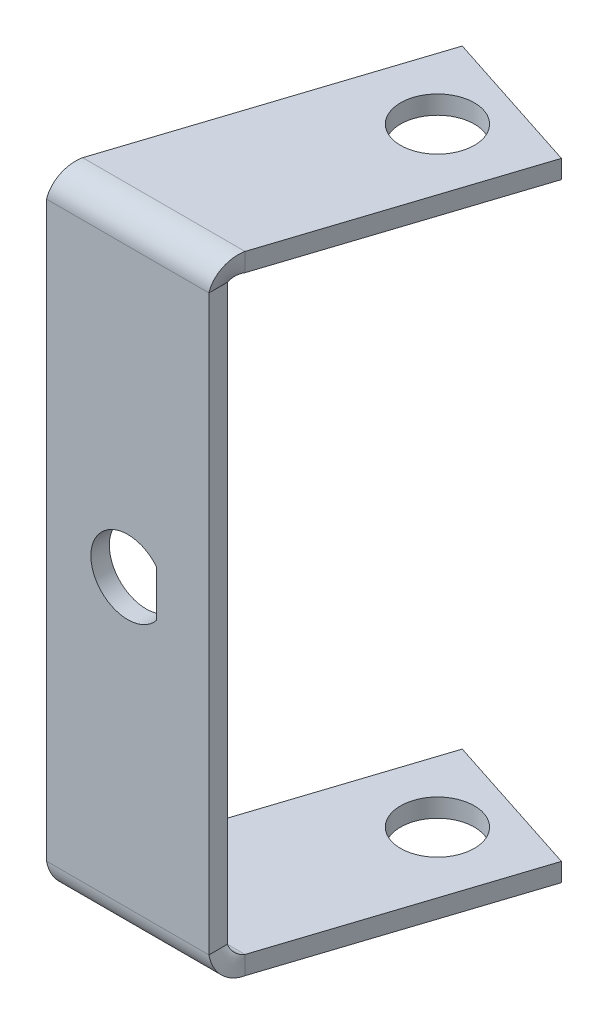
ISO-10303-21;
HEADER;
FILE_DESCRIPTION(('STEP AP214'),'2;1');
FILE_NAME('part.step','',(''),(''),'','','');
FILE_SCHEMA(('AUTOMOTIVE_DESIGN { 1 0 10303 214 1 1 1 1 }'));
ENDSEC;
DATA;
#1=APPLICATION_CONTEXT('core data for automotive mechanical design processes');
#2=APPLICATION_PROTOCOL_DEFINITION('international standard','automotive_design',2000,#1);
#3=PRODUCT_CONTEXT('',#1,'mechanical');
#4=PRODUCT('Part','Part','',(#3));
#5=PRODUCT_RELATED_PRODUCT_CATEGORY('part','',(#4));
#6=PRODUCT_DEFINITION_FORMATION('','',#4);
#7=PRODUCT_DEFINITION_CONTEXT('part definition',#1,'design');
#8=PRODUCT_DEFINITION('design','',#6,#7);
#9=PRODUCT_DEFINITION_SHAPE('','',#8);
#10=(LENGTH_UNIT() NAMED_UNIT(*) SI_UNIT(.MILLI.,.METRE.));
#11=(NAMED_UNIT(*) PLANE_ANGLE_UNIT() SI_UNIT($,.RADIAN.));
#12=(NAMED_UNIT(*) SI_UNIT($,.STERADIAN.) SOLID_ANGLE_UNIT());
#13=UNCERTAINTY_MEASURE_WITH_UNIT(LENGTH_MEASURE(1.E-05),#10,'distance_accuracy_value','');
#14=(GEOMETRIC_REPRESENTATION_CONTEXT(3) GLOBAL_UNCERTAINTY_ASSIGNED_CONTEXT((#13)) GLOBAL_UNIT_ASSIGNED_CONTEXT((#10,
#11,#12)) REPRESENTATION_CONTEXT('',''));
#15=CARTESIAN_POINT('',(0.,0.,0.));
#16=DIRECTION('',(0.,0.,1.));
#17=DIRECTION('',(1.,0.,0.));
#18=AXIS2_PLACEMENT_3D('',#15,#16,#17);
#19=CARTESIAN_POINT('',(0.,0.,-1.5875));
#20=DIRECTION('',(0.,0.,1.));
#21=DIRECTION('',(1.,0.,0.));
#22=AXIS2_PLACEMENT_3D('',#19,#20,#21);
#23=PLANE('',#22);
#24=DIRECTION('',(0.,1.,0.));
#25=VECTOR('',#24,1.);
#26=CARTESIAN_POINT('',(2.4892,-1.97091561463195,-1.5875));
#27=LINE('',#26,#25);
#28=CARTESIAN_POINT('',(2.4892,-1.97091561463195,-1.5875));
#29=VERTEX_POINT('',#28);
#30=CARTESIAN_POINT('',(2.4892,1.97091561463193,-1.5875));
#31=VERTEX_POINT('',#30);
#32=EDGE_CURVE('E441',#29,#31,#27,.T.);
#33=ORIENTED_EDGE('',*,*,#32,.T.);
#34=CARTESIAN_POINT('',(0.,0.,-1.5875));
#35=DIRECTION('',(0.,0.,1.));
#36=DIRECTION('',(1.,0.,0.));
#37=AXIS2_PLACEMENT_3D('',#34,#35,#36);
#38=CIRCLE('',#37,3.175);
#39=EDGE_CURVE('E432',#31,#29,#38,.T.);
#40=ORIENTED_EDGE('',*,*,#39,.T.);
#41=EDGE_LOOP('',(#33,#40));
#42=FACE_BOUND('',#41,.T.);
#43=DIRECTION('',(0.,1.,0.));
#44=VECTOR('',#43,1.);
#45=CARTESIAN_POINT('',(6.985,24.6634,-1.5875));
#46=LINE('',#45,#44);
#47=CARTESIAN_POINT('',(6.985,-24.6634,-1.5875));
#48=VERTEX_POINT('',#47);
#49=CARTESIAN_POINT('',(6.985,24.6634,-1.5875));
#50=VERTEX_POINT('',#49);
#51=EDGE_CURVE('E440',#48,#50,#46,.T.);
#52=ORIENTED_EDGE('',*,*,#51,.F.);
#53=DIRECTION('',(-1.,0.,0.));
#54=VECTOR('',#53,1.);
#55=CARTESIAN_POINT('',(0.,-24.6634,-1.5875));
#56=LINE('',#55,#54);
#57=CARTESIAN_POINT('',(-6.98499999999999,-24.6634,-1.5875));
#58=VERTEX_POINT('',#57);
#59=EDGE_CURVE('E578',#48,#58,#56,.T.);
#60=ORIENTED_EDGE('',*,*,#59,.T.);
#61=DIRECTION('',(0.,-1.,0.));
#62=VECTOR('',#61,1.);
#63=CARTESIAN_POINT('',(-6.985,24.6634,-1.5875));
#64=LINE('',#63,#62);
#65=CARTESIAN_POINT('',(-6.985,24.6634,-1.5875));
#66=VERTEX_POINT('',#65);
#67=EDGE_CURVE('E663',#66,#58,#64,.T.);
#68=ORIENTED_EDGE('',*,*,#67,.F.);
#69=DIRECTION('',(-1.,0.,0.));
#70=VECTOR('',#69,1.);
#71=CARTESIAN_POINT('',(0.,24.6634,-1.5875));
#72=LINE('',#71,#70);
#73=EDGE_CURVE('E474',#50,#66,#72,.T.);
#74=ORIENTED_EDGE('',*,*,#73,.F.);
#75=EDGE_LOOP('',(#52,#60,#68,#74));
#76=FACE_BOUND('',#75,.T.);
#77=ADVANCED_FACE('F73',(#42,#76),#23,.F.);
#78=CARTESIAN_POINT('',(0.,25.4000000000001,24.7431681587106));
#79=DIRECTION('',(0.,1.,0.));
#80=DIRECTION('',(1.,0.,0.));
#81=AXIS2_PLACEMENT_3D('',#78,#79,#80);
#82=PLANE('',#81);
#83=CARTESIAN_POINT('',(6.5537818899881,25.4,-20.0906984703436));
#84=DIRECTION('',(0.,1.,0.));
#85=DIRECTION('',(1.,0.,0.));
#86=AXIS2_PLACEMENT_3D('',#83,#84,#85);
#87=CIRCLE('',#86,3.175);
#88=CARTESIAN_POINT('',(9.7287818899881,25.4,-20.0906984703436));
#89=VERTEX_POINT('',#88);
#90=EDGE_CURVE('E613',#89,#89,#87,.T.);
#91=ORIENTED_EDGE('',*,*,#90,.T.);
#92=EDGE_LOOP('',(#91));
#93=FACE_BOUND('',#92,.T.);
#94=DIRECTION('',(0.309016994374941,0.,-0.951056516295156));
#95=VECTOR('',#94,1.);
#96=CARTESIAN_POINT('',(6.985,25.4,0.0797681587105803));
#97=LINE('',#96,#95);
#98=CARTESIAN_POINT('',(7.76606411191218,25.4,-2.32410000000001));
#99=VERTEX_POINT('',#98);
#100=CARTESIAN_POINT('',(14.4415800742673,25.3999999999999,-22.8692255794915));
#101=VERTEX_POINT('',#100);
#102=EDGE_CURVE('E602',#99,#101,#97,.T.);
#103=ORIENTED_EDGE('',*,*,#102,.F.);
#104=DIRECTION('',(-1.,0.,0.));
#105=VECTOR('',#104,1.);
#106=CARTESIAN_POINT('',(0.,25.4,-2.32410000000001));
#107=LINE('',#106,#105);
#108=CARTESIAN_POINT('',(-6.20393588808782,25.4,-2.3241));
#109=VERTEX_POINT('',#108);
#110=EDGE_CURVE('E593',#99,#109,#107,.T.);
#111=ORIENTED_EDGE('',*,*,#110,.T.);
#112=DIRECTION('',(-0.309016994374941,0.,0.951056516295156));
#113=VECTOR('',#112,1.);
#114=CARTESIAN_POINT('',(1.80559636855826,25.3999999999999,-26.9749055667544));
#115=LINE('',#114,#113);
#116=CARTESIAN_POINT('',(1.80559636855826,25.3999999999999,-26.9749055667544));
#117=VERTEX_POINT('',#116);
#118=EDGE_CURVE('E622',#117,#109,#115,.T.);
#119=ORIENTED_EDGE('',*,*,#118,.F.);
#120=DIRECTION('',(-0.951056516295156,0.,-0.309016994374941));
#121=VECTOR('',#120,1.);
#122=CARTESIAN_POINT('',(14.4415800742673,25.3999999999999,-22.8692255794915));
#123=LINE('',#122,#121);
#124=EDGE_CURVE('E608',#101,#117,#123,.T.);
#125=ORIENTED_EDGE('',*,*,#124,.F.);
#126=EDGE_LOOP('',(#103,#111,#119,#125));
#127=FACE_BOUND('',#126,.T.);
#128=ADVANCED_FACE('F539',(#93,#127),#82,.F.);
#129=CARTESIAN_POINT('',(1.80559636855826,25.3999999999999,-26.9749055667544));
#130=DIRECTION('',(-0.951056516295156,0.,-0.309016994374941));
#131=DIRECTION('',(-0.309016994374941,0.,0.951056516295156));
#132=AXIS2_PLACEMENT_3D('',#129,#130,#131);
#133=PLANE('',#132);
#134=CARTESIAN_POINT('',(-6.20393588808782,26.9875,-2.32410000000002));
#135=CARTESIAN_POINT('',(-6.20393588808782,25.4,-2.32410000000001));
#136=B_SPLINE_CURVE_WITH_KNOTS('',1,(#134,#135),.UNSPECIFIED.,.F.,.F.,(2,2),(0.,1.),.UNSPECIFIED.);
#137=CARTESIAN_POINT('',(-6.20393588808782,26.9875,-2.32410000000002));
#138=VERTEX_POINT('',#137);
#139=EDGE_CURVE('E585',#138,#109,#136,.T.);
#140=ORIENTED_EDGE('',*,*,#139,.F.);
#141=DIRECTION('',(-0.309016994374941,0.,0.951056516295156));
#142=VECTOR('',#141,1.);
#143=CARTESIAN_POINT('',(1.80559636855826,26.9874999999999,-26.9749055667544));
#144=LINE('',#143,#142);
#145=CARTESIAN_POINT('',(1.80559636855826,26.9874999999999,-26.9749055667544));
#146=VERTEX_POINT('',#145);
#147=EDGE_CURVE('E600',#146,#138,#144,.T.);
#148=ORIENTED_EDGE('',*,*,#147,.F.);
#149=DIRECTION('',(0.,1.,0.));
#150=VECTOR('',#149,1.);
#151=CARTESIAN_POINT('',(1.80559636855826,25.3999999999999,-26.9749055667544));
#152=LINE('',#151,#150);
#153=EDGE_CURVE('E617',#117,#146,#152,.T.);
#154=ORIENTED_EDGE('',*,*,#153,.F.);
#155=ORIENTED_EDGE('',*,*,#118,.T.);
#156=EDGE_LOOP('',(#140,#148,#154,#155));
#157=FACE_BOUND('',#156,.T.);
#158=ADVANCED_FACE('F544',(#157),#133,.T.);
#159=CARTESIAN_POINT('',(14.4415800742673,25.3999999999999,-22.8692255794915));
#160=DIRECTION('',(0.309016994374941,0.,-0.951056516295156));
#161=DIRECTION('',(-0.951056516295156,0.,-0.309016994374941));
#162=AXIS2_PLACEMENT_3D('',#159,#160,#161);
#163=PLANE('',#162);
#164=DIRECTION('',(-0.951056516295156,0.,-0.309016994374941));
#165=VECTOR('',#164,1.);
#166=CARTESIAN_POINT('',(14.4415800742673,26.9874999999999,-22.8692255794915));
#167=LINE('',#166,#165);
#168=CARTESIAN_POINT('',(14.4415800742673,26.9874999999999,-22.8692255794915));
#169=VERTEX_POINT('',#168);
#170=EDGE_CURVE('E603',#169,#146,#167,.T.);
#171=ORIENTED_EDGE('',*,*,#170,.F.);
#172=DIRECTION('',(0.,1.,0.));
#173=VECTOR('',#172,1.);
#174=CARTESIAN_POINT('',(14.4415800742673,25.3999999999999,-22.8692255794915));
#175=LINE('',#174,#173);
#176=EDGE_CURVE('E619',#101,#169,#175,.T.);
#177=ORIENTED_EDGE('',*,*,#176,.F.);
#178=ORIENTED_EDGE('',*,*,#124,.T.);
#179=ORIENTED_EDGE('',*,*,#153,.T.);
#180=EDGE_LOOP('',(#171,#177,#178,#179));
#181=FACE_BOUND('',#180,.T.);
#182=ADVANCED_FACE('F552',(#181),#163,.T.);
#183=CARTESIAN_POINT('',(6.985,25.4,0.0797681587105803));
#184=DIRECTION('',(0.951056516295156,0.,0.309016994374941));
#185=DIRECTION('',(0.309016994374941,0.,-0.951056516295156));
#186=AXIS2_PLACEMENT_3D('',#183,#184,#185);
#187=PLANE('',#186);
#188=CARTESIAN_POINT('',(7.76606411191218,25.4,-2.32410000000001));
#189=CARTESIAN_POINT('',(7.76606411191218,26.9875,-2.32410000000002));
#190=B_SPLINE_CURVE_WITH_KNOTS('',1,(#188,#189),.UNSPECIFIED.,.F.,.F.,(2,2),(0.,1.),.UNSPECIFIED.);
#191=CARTESIAN_POINT('',(7.76606411191218,26.9875,-2.32410000000002));
#192=VERTEX_POINT('',#191);
#193=EDGE_CURVE('E590',#99,#192,#190,.T.);
#194=ORIENTED_EDGE('',*,*,#193,.F.);
#195=ORIENTED_EDGE('',*,*,#102,.T.);
#196=ORIENTED_EDGE('',*,*,#176,.T.);
#197=DIRECTION('',(0.309016994374941,0.,-0.951056516295156));
#198=VECTOR('',#197,1.);
#199=CARTESIAN_POINT('',(6.985,26.9875,0.0797681587105734));
#200=LINE('',#199,#198);
#201=EDGE_CURVE('E610',#192,#169,#200,.T.);
#202=ORIENTED_EDGE('',*,*,#201,.F.);
#203=EDGE_LOOP('',(#194,#195,#196,#202));
#204=FACE_BOUND('',#203,.T.);
#205=ADVANCED_FACE('F637',(#204),#187,.T.);
#206=CARTESIAN_POINT('',(0.,26.9875000000001,24.7431681587106));
#207=DIRECTION('',(0.,1.,0.));
#208=DIRECTION('',(1.,0.,0.));
#209=AXIS2_PLACEMENT_3D('',#206,#207,#208);
#210=PLANE('',#209);
#211=DIRECTION('',(-1.,0.,0.));
#212=VECTOR('',#211,1.);
#213=CARTESIAN_POINT('',(0.,26.9875,-2.3241));
#214=LINE('',#213,#212);
#215=EDGE_CURVE('E588',#192,#138,#214,.T.);
#216=ORIENTED_EDGE('',*,*,#215,.F.);
#217=ORIENTED_EDGE('',*,*,#201,.T.);
#218=ORIENTED_EDGE('',*,*,#170,.T.);
#219=ORIENTED_EDGE('',*,*,#147,.T.);
#220=EDGE_LOOP('',(#216,#217,#218,#219));
#221=FACE_BOUND('',#220,.T.);
#222=CARTESIAN_POINT('',(6.5537818899881,26.9875,-20.0906984703436));
#223=DIRECTION('',(0.,1.,0.));
#224=DIRECTION('',(1.,0.,0.));
#225=AXIS2_PLACEMENT_3D('',#222,#223,#224);
#226=CIRCLE('',#225,3.175);
#227=CARTESIAN_POINT('',(9.7287818899881,26.9875,-20.0906984703436));
#228=VERTEX_POINT('',#227);
#229=EDGE_CURVE('E661',#228,#228,#226,.T.);
#230=ORIENTED_EDGE('',*,*,#229,.F.);
#231=EDGE_LOOP('',(#230));
#232=FACE_BOUND('',#231,.T.);
#233=ADVANCED_FACE('F554',(#221,#232),#210,.T.);
#234=CARTESIAN_POINT('',(6.5537818899881,25.4,-20.0906984703436));
#235=DIRECTION('',(0.,1.,0.));
#236=DIRECTION('',(1.,0.,0.));
#237=AXIS2_PLACEMENT_3D('',#234,#235,#236);
#238=CYLINDRICAL_SURFACE('',#237,3.175);
#239=ORIENTED_EDGE('',*,*,#90,.F.);
#240=EDGE_LOOP('',(#239));
#241=FACE_BOUND('',#240,.T.);
#242=ORIENTED_EDGE('',*,*,#229,.T.);
#243=EDGE_LOOP('',(#242));
#244=FACE_BOUND('',#243,.T.);
#245=ADVANCED_FACE('F648',(#241,#244),#238,.F.);
#246=CARTESIAN_POINT('',(0.,0.,-1.5875));
#247=DIRECTION('',(0.,0.,1.));
#248=DIRECTION('',(1.,0.,0.));
#249=AXIS2_PLACEMENT_3D('',#246,#247,#248);
#250=CYLINDRICAL_SURFACE('',#249,3.175);
#251=CARTESIAN_POINT('',(0.,0.,0.));
#252=DIRECTION('',(0.,0.,1.));
#253=DIRECTION('',(1.,0.,0.));
#254=AXIS2_PLACEMENT_3D('',#251,#252,#253);
#255=CIRCLE('',#254,3.175);
#256=CARTESIAN_POINT('',(2.4892,1.97091561463193,0.));
#257=VERTEX_POINT('',#256);
#258=CARTESIAN_POINT('',(2.4892,-1.97091561463195,0.));
#259=VERTEX_POINT('',#258);
#260=EDGE_CURVE('E452',#257,#259,#255,.T.);
#261=ORIENTED_EDGE('',*,*,#260,.T.);
#262=DIRECTION('',(0.,0.,1.));
#263=VECTOR('',#262,1.);
#264=CARTESIAN_POINT('',(2.4892,-1.97091561463195,-1.5875));
#265=LINE('',#264,#263);
#266=EDGE_CURVE('E444',#29,#259,#265,.T.);
#267=ORIENTED_EDGE('',*,*,#266,.F.);
#268=ORIENTED_EDGE('',*,*,#39,.F.);
#269=DIRECTION('',(0.,0.,1.));
#270=VECTOR('',#269,1.);
#271=CARTESIAN_POINT('',(2.4892,1.97091561463193,-1.5875));
#272=LINE('',#271,#270);
#273=EDGE_CURVE('E450',#31,#257,#272,.T.);
#274=ORIENTED_EDGE('',*,*,#273,.T.);
#275=EDGE_LOOP('',(#261,#267,#268,#274));
#276=FACE_BOUND('',#275,.T.);
#277=ADVANCED_FACE('F402',(#276),#250,.F.);
#278=CARTESIAN_POINT('',(2.4892,-1.97091561463195,-1.5875));
#279=DIRECTION('',(1.,0.,0.));
#280=DIRECTION('',(0.,0.,-1.));
#281=AXIS2_PLACEMENT_3D('',#278,#279,#280);
#282=PLANE('',#281);
#283=DIRECTION('',(0.,1.,0.));
#284=VECTOR('',#283,1.);
#285=CARTESIAN_POINT('',(2.4892,-1.97091561463195,0.));
#286=LINE('',#285,#284);
#287=EDGE_CURVE('E447',#259,#257,#286,.T.);
#288=ORIENTED_EDGE('',*,*,#287,.T.);
#289=ORIENTED_EDGE('',*,*,#273,.F.);
#290=ORIENTED_EDGE('',*,*,#32,.F.);
#291=ORIENTED_EDGE('',*,*,#266,.T.);
#292=EDGE_LOOP('',(#288,#289,#290,#291));
#293=FACE_BOUND('',#292,.T.);
#294=ADVANCED_FACE('F485',(#293),#282,.F.);
#295=CARTESIAN_POINT('',(6.985,24.6634,-1.5875));
#296=DIRECTION('',(1.,0.,0.));
#297=DIRECTION('',(0.,1.,0.));
#298=AXIS2_PLACEMENT_3D('',#295,#296,#297);
#299=PLANE('',#298);
#300=DIRECTION('',(0.,1.,0.));
#301=VECTOR('',#300,1.);
#302=CARTESIAN_POINT('',(6.985,24.6634,0.));
#303=LINE('',#302,#301);
#304=CARTESIAN_POINT('',(6.985,-24.6634,0.));
#305=VERTEX_POINT('',#304);
#306=CARTESIAN_POINT('',(6.985,24.6634,0.));
#307=VERTEX_POINT('',#306);
#308=EDGE_CURVE('E458',#305,#307,#303,.T.);
#309=ORIENTED_EDGE('',*,*,#308,.F.);
#310=CARTESIAN_POINT('',(6.985,-24.6634,-1.5875));
#311=CARTESIAN_POINT('',(6.985,-24.6634,0.));
#312=B_SPLINE_CURVE_WITH_KNOTS('',1,(#310,#311),.UNSPECIFIED.,.F.,.F.,(2,2),(0.,1.),.UNSPECIFIED.);
#313=EDGE_CURVE('E315',#48,#305,#312,.T.);
#314=ORIENTED_EDGE('',*,*,#313,.F.);
#315=ORIENTED_EDGE('',*,*,#51,.T.);
#316=CARTESIAN_POINT('',(6.985,24.6634,0.));
#317=CARTESIAN_POINT('',(6.985,24.6634,-1.5875));
#318=B_SPLINE_CURVE_WITH_KNOTS('',1,(#316,#317),.UNSPECIFIED.,.F.,.F.,(2,2),(0.,1.),.UNSPECIFIED.);
#319=EDGE_CURVE('E463',#50,#307,#318,.F.);
#320=ORIENTED_EDGE('',*,*,#319,.T.);
#321=EDGE_LOOP('',(#309,#314,#315,#320));
#322=FACE_BOUND('',#321,.T.);
#323=ADVANCED_FACE('F476',(#322),#299,.T.);
#324=CARTESIAN_POINT('',(0.,0.,0.));
#325=DIRECTION('',(0.,0.,1.));
#326=DIRECTION('',(1.,0.,0.));
#327=AXIS2_PLACEMENT_3D('',#324,#325,#326);
#328=PLANE('',#327);
#329=DIRECTION('',(-1.,0.,0.));
#330=VECTOR('',#329,1.);
#331=CARTESIAN_POINT('',(0.,-24.6634,0.));
#332=LINE('',#331,#330);
#333=CARTESIAN_POINT('',(-6.985,-24.6634,0.));
#334=VERTEX_POINT('',#333);
#335=EDGE_CURVE('E84',#305,#334,#332,.T.);
#336=ORIENTED_EDGE('',*,*,#335,.F.);
#337=ORIENTED_EDGE('',*,*,#308,.T.);
#338=DIRECTION('',(-1.,0.,0.));
#339=VECTOR('',#338,1.);
#340=CARTESIAN_POINT('',(0.,24.6634,0.));
#341=LINE('',#340,#339);
#342=CARTESIAN_POINT('',(-6.985,24.6634,0.));
#343=VERTEX_POINT('',#342);
#344=EDGE_CURVE('E454',#307,#343,#341,.T.);
#345=ORIENTED_EDGE('',*,*,#344,.T.);
#346=DIRECTION('',(0.,-1.,0.));
#347=VECTOR('',#346,1.);
#348=CARTESIAN_POINT('',(-6.985,24.6634,0.));
#349=LINE('',#348,#347);
#350=EDGE_CURVE('E457',#343,#334,#349,.T.);
#351=ORIENTED_EDGE('',*,*,#350,.T.);
#352=EDGE_LOOP('',(#336,#337,#345,#351));
#353=FACE_BOUND('',#352,.T.);
#354=ORIENTED_EDGE('',*,*,#260,.F.);
#355=ORIENTED_EDGE('',*,*,#287,.F.);
#356=EDGE_LOOP('',(#354,#355));
#357=FACE_BOUND('',#356,.T.);
#358=ADVANCED_FACE('F75',(#353,#357),#328,.T.);
#359=CARTESIAN_POINT('',(-6.985,24.6634,-1.5875));
#360=DIRECTION('',(-1.,0.,0.));
#361=DIRECTION('',(0.,-1.,0.));
#362=AXIS2_PLACEMENT_3D('',#359,#360,#361);
#363=PLANE('',#362);
#364=ORIENTED_EDGE('',*,*,#350,.F.);
#365=CARTESIAN_POINT('',(-6.985,24.6634,-1.5875));
#366=CARTESIAN_POINT('',(-6.985,24.6634,0.));
#367=B_SPLINE_CURVE_WITH_KNOTS('',1,(#365,#366),.UNSPECIFIED.,.F.,.F.,(2,2),(0.,1.),.UNSPECIFIED.);
#368=EDGE_CURVE('E428',#66,#343,#367,.T.);
#369=ORIENTED_EDGE('',*,*,#368,.F.);
#370=ORIENTED_EDGE('',*,*,#67,.T.);
#371=CARTESIAN_POINT('',(-6.98499999999999,-24.6634,0.));
#372=CARTESIAN_POINT('',(-6.98499999999999,-24.6634,-1.5875));
#373=B_SPLINE_CURVE_WITH_KNOTS('',1,(#371,#372),.UNSPECIFIED.,.F.,.F.,(2,2),(0.,1.),.UNSPECIFIED.);
#374=EDGE_CURVE('E12',#58,#334,#373,.F.);
#375=ORIENTED_EDGE('',*,*,#374,.T.);
#376=EDGE_LOOP('',(#364,#369,#370,#375));
#377=FACE_BOUND('',#376,.T.);
#378=ADVANCED_FACE('F486',(#377),#363,.T.);
#379=CARTESIAN_POINT('',(7.76606411191218,26.9875,-2.32410000000002));
#380=CARTESIAN_POINT('',(7.70096421427411,26.9875,-2.01982357152247));
#381=CARTESIAN_POINT('',(7.63588675992681,26.9270098978449,-1.71577174196061));
#382=CARTESIAN_POINT('',(7.50570940794145,26.6941669451741,-1.15363912771999));
#383=CARTESIAN_POINT('',(7.44062073194877,26.5219057084176,-0.895831968106298));
#384=CARTESIAN_POINT('',(7.31044337996341,26.0916680318937,-0.465594291582382));
#385=CARTESIAN_POINT('',(7.24535470397072,25.83386087228,-0.293333054825862));
#386=CARTESIAN_POINT('',(7.11517735198536,25.2717282580394,-0.0604901021551614));
#387=CARTESIAN_POINT('',(7.05009989763807,24.9676764284775,0.));
#388=CARTESIAN_POINT('',(6.985,24.6634,0.));
#389=CARTESIAN_POINT('',(7.76606411191218,25.4,-2.32410000000001));
#390=CARTESIAN_POINT('',(7.70096737424067,25.4,-2.22766734310694));
#391=CARTESIAN_POINT('',(7.63588675992681,25.3808282736339,-2.13129650838096));
#392=CARTESIAN_POINT('',(7.50570940794145,25.3070310536618,-1.9531342590588));
#393=CARTESIAN_POINT('',(7.44062073194877,25.2524345961105,-1.87142488606648));
#394=CARTESIAN_POINT('',(7.31044337996341,25.1160751139335,-1.7350654038895));
#395=CARTESIAN_POINT('',(7.24535470397072,25.0343657409412,-1.68046894633825));
#396=CARTESIAN_POINT('',(7.11517735198536,24.8562034916191,-1.60667172636612));
#397=CARTESIAN_POINT('',(7.05009673767151,24.7598326568931,-1.5875));
#398=CARTESIAN_POINT('',(6.985,24.6634,-1.5875));
#399=B_SPLINE_SURFACE_WITH_KNOTS('',1,3,((#379,#380,#381,#382,#383,#384,#385,#386,#387,#388),
(#389,#390,#391,#392,#393,#394,#395,#396,#397,#398)),.UNSPECIFIED.,.F.,.F.,.F.,(2,2),(4,2,2,2,
4),(0.,1.),(0.,0.25,0.5,0.75,1.),.UNSPECIFIED.);
#400=CARTESIAN_POINT('',(7.76606411191218,26.9875,-2.32410000000002));
#401=CARTESIAN_POINT('',(7.70096421427411,26.9875,-2.01982357152247));
#402=CARTESIAN_POINT('',(7.63588675992681,26.9270098978449,-1.71577174196061));
#403=CARTESIAN_POINT('',(7.50570940794145,26.6941669451741,-1.15363912771999));
#404=CARTESIAN_POINT('',(7.44062073194877,26.5219057084176,-0.895831968106298));
#405=CARTESIAN_POINT('',(7.31044337996341,26.0916680318937,-0.465594291582382));
#406=CARTESIAN_POINT('',(7.24535470397072,25.83386087228,-0.293333054825862));
#407=CARTESIAN_POINT('',(7.11517735198536,25.2717282580394,-0.0604901021551614));
#408=CARTESIAN_POINT('',(7.05009989763807,24.9676764284775,0.));
#409=CARTESIAN_POINT('',(6.985,24.6634,0.));
#410=B_SPLINE_CURVE_WITH_KNOTS('',3,(#400,#401,#402,#403,#404,#405,#406,#407,#408,#409),
.UNSPECIFIED.,.F.,.F.,(4,2,2,2,4),(0.,0.25,0.5,0.75,1.),.UNSPECIFIED.);
#411=EDGE_CURVE('E352',#192,#307,#410,.T.);
#412=CARTESIAN_POINT('',(6.985,24.6634,-1.5875));
#413=CARTESIAN_POINT('',(7.05009673767151,24.7598326568931,-1.5875));
#414=CARTESIAN_POINT('',(7.11517735198536,24.8562034916191,-1.60667172636612));
#415=CARTESIAN_POINT('',(7.24535470397072,25.0343657409412,-1.68046894633825));
#416=CARTESIAN_POINT('',(7.31044337996341,25.1160751139335,-1.7350654038895));
#417=CARTESIAN_POINT('',(7.44062073194877,25.2524345961105,-1.87142488606648));
#418=CARTESIAN_POINT('',(7.50570940794145,25.3070310536618,-1.9531342590588));
#419=CARTESIAN_POINT('',(7.63588675992681,25.3808282736339,-2.13129650838096));
#420=CARTESIAN_POINT('',(7.70096737424067,25.4,-2.22766734310694));
#421=CARTESIAN_POINT('',(7.76606411191218,25.4,-2.32410000000001));
#422=B_SPLINE_CURVE_WITH_KNOTS('',3,(#412,#413,#414,#415,#416,#417,#418,#419,#420,#421),
.UNSPECIFIED.,.F.,.F.,(4,2,2,2,4),(0.,0.25,0.5,0.75,1.),.UNSPECIFIED.);
#423=EDGE_CURVE('E346',#99,#50,#422,.F.);
#424=ORIENTED_EDGE('',*,*,#193,.T.);
#425=ORIENTED_EDGE('',*,*,#411,.T.);
#426=ORIENTED_EDGE('',*,*,#319,.F.);
#427=ORIENTED_EDGE('',*,*,#423,.F.);
#428=EDGE_LOOP('',(#424,#425,#426,#427));
#429=FACE_BOUND('',#428,.T.);
#430=ADVANCED_FACE('F366',(#429),#399,.F.);
#431=CARTESIAN_POINT('',(-6.985,24.6634,0.));
#432=CARTESIAN_POINT('',(-6.91990010236193,24.9676764284775,0.));
#433=CARTESIAN_POINT('',(-6.85482264801464,25.2717282580394,-0.0604901021551614));
#434=CARTESIAN_POINT('',(-6.72464529602928,25.83386087228,-0.293333054825862));
#435=CARTESIAN_POINT('',(-6.6595566200366,26.0916680318937,-0.465594291582382));
#436=CARTESIAN_POINT('',(-6.52937926805123,26.5219057084176,-0.895831968106298));
#437=CARTESIAN_POINT('',(-6.46429059205855,26.6941669451741,-1.15363912771999));
#438=CARTESIAN_POINT('',(-6.33411324007319,26.9270098978449,-1.71577174196061));
#439=CARTESIAN_POINT('',(-6.26903578572589,26.9875,-2.01982357152247));
#440=CARTESIAN_POINT('',(-6.20393588808782,26.9875,-2.32410000000002));
#441=CARTESIAN_POINT('',(-6.985,24.6634,-1.5875));
#442=CARTESIAN_POINT('',(-6.91990326232849,24.7598326568931,-1.5875));
#443=CARTESIAN_POINT('',(-6.85482264801464,24.8562034916191,-1.60667172636612));
#444=CARTESIAN_POINT('',(-6.72464529602928,25.0343657409412,-1.68046894633825));
#445=CARTESIAN_POINT('',(-6.6595566200366,25.1160751139335,-1.7350654038895));
#446=CARTESIAN_POINT('',(-6.52937926805123,25.2524345961105,-1.87142488606648));
#447=CARTESIAN_POINT('',(-6.46429059205855,25.3070310536618,-1.9531342590588));
#448=CARTESIAN_POINT('',(-6.33411324007319,25.3808282736339,-2.13129650838096));
#449=CARTESIAN_POINT('',(-6.26903262575933,25.4,-2.22766734310694));
#450=CARTESIAN_POINT('',(-6.20393588808782,25.4,-2.32410000000001));
#451=B_SPLINE_SURFACE_WITH_KNOTS('',1,3,((#431,#432,#433,#434,#435,#436,#437,#438,#439,#440),
(#441,#442,#443,#444,#445,#446,#447,#448,#449,#450)),.UNSPECIFIED.,.F.,.F.,.F.,(2,2),(4,2,2,2,
4),(0.,1.),(0.,0.25,0.5,0.75,1.),.UNSPECIFIED.);
#452=CARTESIAN_POINT('',(-6.985,24.6634,0.));
#453=CARTESIAN_POINT('',(-6.91990010236193,24.9676764284775,0.));
#454=CARTESIAN_POINT('',(-6.85482264801464,25.2717282580394,-0.0604901021551614));
#455=CARTESIAN_POINT('',(-6.72464529602928,25.83386087228,-0.293333054825862));
#456=CARTESIAN_POINT('',(-6.6595566200366,26.0916680318937,-0.465594291582382));
#457=CARTESIAN_POINT('',(-6.52937926805123,26.5219057084176,-0.895831968106298));
#458=CARTESIAN_POINT('',(-6.46429059205855,26.6941669451741,-1.15363912771999));
#459=CARTESIAN_POINT('',(-6.33411324007319,26.9270098978449,-1.71577174196061));
#460=CARTESIAN_POINT('',(-6.26903578572589,26.9875,-2.01982357152247));
#461=CARTESIAN_POINT('',(-6.20393588808782,26.9875,-2.32410000000002));
#462=B_SPLINE_CURVE_WITH_KNOTS('',3,(#452,#453,#454,#455,#456,#457,#458,#459,#460,#461),
.UNSPECIFIED.,.F.,.F.,(4,2,2,2,4),(0.,0.25,0.5,0.75,1.),.UNSPECIFIED.);
#463=EDGE_CURVE('E688',#343,#138,#462,.T.);
#464=CARTESIAN_POINT('',(-6.20393588808782,25.4,-2.32410000000001));
#465=CARTESIAN_POINT('',(-6.26903262575933,25.4,-2.22766734310694));
#466=CARTESIAN_POINT('',(-6.33411324007319,25.3808282736339,-2.13129650838096));
#467=CARTESIAN_POINT('',(-6.46429059205855,25.3070310536618,-1.9531342590588));
#468=CARTESIAN_POINT('',(-6.52937926805123,25.2524345961105,-1.87142488606648));
#469=CARTESIAN_POINT('',(-6.6595566200366,25.1160751139335,-1.7350654038895));
#470=CARTESIAN_POINT('',(-6.72464529602928,25.0343657409412,-1.68046894633825));
#471=CARTESIAN_POINT('',(-6.85482264801464,24.8562034916191,-1.60667172636612));
#472=CARTESIAN_POINT('',(-6.91990326232849,24.7598326568931,-1.5875));
#473=CARTESIAN_POINT('',(-6.985,24.6634,-1.5875));
#474=B_SPLINE_CURVE_WITH_KNOTS('',3,(#464,#465,#466,#467,#468,#469,#470,#471,#472,#473),
.UNSPECIFIED.,.F.,.F.,(4,2,2,2,4),(0.,0.25,0.5,0.75,1.),.UNSPECIFIED.);
#475=EDGE_CURVE('E98',#66,#109,#474,.F.);
#476=ORIENTED_EDGE('',*,*,#463,.T.);
#477=ORIENTED_EDGE('',*,*,#139,.T.);
#478=ORIENTED_EDGE('',*,*,#475,.F.);
#479=ORIENTED_EDGE('',*,*,#368,.T.);
#480=EDGE_LOOP('',(#476,#477,#478,#479));
#481=FACE_BOUND('',#480,.T.);
#482=ADVANCED_FACE('F391',(#481),#451,.F.);
#483=CARTESIAN_POINT('',(-15.0297249079351,24.6634,-2.3241));
#484=DIRECTION('',(1.,0.,0.));
#485=DIRECTION('',(0.,0.,-1.));
#486=AXIS2_PLACEMENT_3D('',#483,#484,#485);
#487=CYLINDRICAL_SURFACE('',#486,0.7366);
#488=ORIENTED_EDGE('',*,*,#73,.T.);
#489=ORIENTED_EDGE('',*,*,#475,.T.);
#490=ORIENTED_EDGE('',*,*,#110,.F.);
#491=ORIENTED_EDGE('',*,*,#423,.T.);
#492=EDGE_LOOP('',(#488,#489,#490,#491));
#493=FACE_BOUND('',#492,.T.);
#494=ADVANCED_FACE('F288',(#493),#487,.F.);
#495=CARTESIAN_POINT('',(-15.0297249079351,24.6634,-2.3241));
#496=DIRECTION('',(1.,0.,0.));
#497=DIRECTION('',(0.,0.,-1.));
#498=AXIS2_PLACEMENT_3D('',#495,#496,#497);
#499=CYLINDRICAL_SURFACE('',#498,2.3241);
#500=ORIENTED_EDGE('',*,*,#344,.F.);
#501=ORIENTED_EDGE('',*,*,#411,.F.);
#502=ORIENTED_EDGE('',*,*,#215,.T.);
#503=ORIENTED_EDGE('',*,*,#463,.F.);
#504=EDGE_LOOP('',(#500,#501,#502,#503));
#505=FACE_BOUND('',#504,.T.);
#506=ADVANCED_FACE('F284',(#505),#499,.T.);
#507=CARTESIAN_POINT('',(6.985,-24.6634,0.));
#508=CARTESIAN_POINT('',(7.05009989763807,-24.9676764284775,0.));
#509=CARTESIAN_POINT('',(7.11517735198537,-25.2717282580394,-0.0604901021551691));
#510=CARTESIAN_POINT('',(7.24535470397073,-25.83386087228,-0.293333054825872));
#511=CARTESIAN_POINT('',(7.31044337996341,-26.0916680318937,-0.465594291582391));
#512=CARTESIAN_POINT('',(7.44062073194878,-26.5219057084176,-0.895831968106302));
#513=CARTESIAN_POINT('',(7.50570940794146,-26.6941669451741,-1.15363912771999));
#514=CARTESIAN_POINT('',(7.63588675992682,-26.9270098978448,-1.7157717419606));
#515=CARTESIAN_POINT('',(7.70096421427411,-26.9875,-2.01982357152245));
#516=CARTESIAN_POINT('',(7.76606411191218,-26.9875,-2.3241));
#517=CARTESIAN_POINT('',(6.985,-24.6634,-1.5875));
#518=CARTESIAN_POINT('',(7.05009673767152,-24.759832656893,-1.5875));
#519=CARTESIAN_POINT('',(7.11517735198537,-24.856203491619,-1.60667172636612));
#520=CARTESIAN_POINT('',(7.24535470397073,-25.0343657409412,-1.68046894633825));
#521=CARTESIAN_POINT('',(7.31044337996341,-25.1160751139335,-1.7350654038895));
#522=CARTESIAN_POINT('',(7.44062073194878,-25.2524345961105,-1.87142488606648));
#523=CARTESIAN_POINT('',(7.50570940794146,-25.3070310536617,-1.9531342590588));
#524=CARTESIAN_POINT('',(7.63588675992682,-25.3808282736339,-2.13129650838095));
#525=CARTESIAN_POINT('',(7.70096737424068,-25.4,-2.22766734310694));
#526=CARTESIAN_POINT('',(7.76606411191218,-25.4,-2.3241));
#527=B_SPLINE_SURFACE_WITH_KNOTS('',1,3,((#507,#508,#509,#510,#511,#512,#513,#514,#515,#516),
(#517,#518,#519,#520,#521,#522,#523,#524,#525,#526)),.UNSPECIFIED.,.F.,.F.,.F.,(2,2),(4,2,2,2,
4),(0.,1.),(0.,0.25,0.5,0.75,1.),.UNSPECIFIED.);
#528=CARTESIAN_POINT('',(6.985,-24.6634,0.));
#529=CARTESIAN_POINT('',(7.05009989763807,-24.9676764284775,0.));
#530=CARTESIAN_POINT('',(7.11517735198537,-25.2717282580394,-0.0604901021551691));
#531=CARTESIAN_POINT('',(7.24535470397073,-25.83386087228,-0.293333054825872));
#532=CARTESIAN_POINT('',(7.31044337996341,-26.0916680318937,-0.465594291582391));
#533=CARTESIAN_POINT('',(7.44062073194878,-26.5219057084176,-0.895831968106302));
#534=CARTESIAN_POINT('',(7.50570940794146,-26.6941669451741,-1.15363912771999));
#535=CARTESIAN_POINT('',(7.63588675992682,-26.9270098978448,-1.7157717419606));
#536=CARTESIAN_POINT('',(7.70096421427411,-26.9875,-2.01982357152245));
#537=CARTESIAN_POINT('',(7.76606411191218,-26.9875,-2.3241));
#538=B_SPLINE_CURVE_WITH_KNOTS('',3,(#528,#529,#530,#531,#532,#533,#534,#535,#536,#537),
.UNSPECIFIED.,.F.,.F.,(4,2,2,2,4),(0.,0.25,0.5,0.75,1.),.UNSPECIFIED.);
#539=CARTESIAN_POINT('',(7.76606411191218,-26.9875,-2.32410000000002));
#540=VERTEX_POINT('',#539);
#541=EDGE_CURVE('E196',#305,#540,#538,.T.);
#542=CARTESIAN_POINT('',(7.76606411191218,-26.9875,-2.3241));
#543=CARTESIAN_POINT('',(7.76606411191218,-25.4,-2.3241));
#544=B_SPLINE_CURVE_WITH_KNOTS('',1,(#542,#543),.UNSPECIFIED.,.F.,.F.,(2,2),(0.,1.),.UNSPECIFIED.);
#545=CARTESIAN_POINT('',(7.76606411191218,-25.4,-2.32410000000001));
#546=VERTEX_POINT('',#545);
#547=EDGE_CURVE('E507',#546,#540,#544,.F.);
#548=CARTESIAN_POINT('',(7.76606411191218,-25.4,-2.3241));
#549=CARTESIAN_POINT('',(7.70096737424068,-25.4,-2.22766734310694));
#550=CARTESIAN_POINT('',(7.63588675992682,-25.3808282736339,-2.13129650838095));
#551=CARTESIAN_POINT('',(7.50570940794146,-25.3070310536617,-1.9531342590588));
#552=CARTESIAN_POINT('',(7.44062073194878,-25.2524345961105,-1.87142488606648));
#553=CARTESIAN_POINT('',(7.31044337996341,-25.1160751139335,-1.7350654038895));
#554=CARTESIAN_POINT('',(7.24535470397073,-25.0343657409412,-1.68046894633825));
#555=CARTESIAN_POINT('',(7.11517735198537,-24.856203491619,-1.60667172636612));
#556=CARTESIAN_POINT('',(7.05009673767152,-24.759832656893,-1.5875));
#557=CARTESIAN_POINT('',(6.985,-24.6634,-1.5875));
#558=B_SPLINE_CURVE_WITH_KNOTS('',3,(#548,#549,#550,#551,#552,#553,#554,#555,#556,#557),
.UNSPECIFIED.,.F.,.F.,(4,2,2,2,4),(0.,0.25,0.5,0.75,1.),.UNSPECIFIED.);
#559=EDGE_CURVE('E252',#48,#546,#558,.F.);
#560=ORIENTED_EDGE('',*,*,#313,.T.);
#561=ORIENTED_EDGE('',*,*,#541,.T.);
#562=ORIENTED_EDGE('',*,*,#547,.F.);
#563=ORIENTED_EDGE('',*,*,#559,.F.);
#564=EDGE_LOOP('',(#560,#561,#562,#563));
#565=FACE_BOUND('',#564,.T.);
#566=ADVANCED_FACE('F273',(#565),#527,.F.);
#567=CARTESIAN_POINT('',(-6.20393588808782,-26.9875,-2.3241));
#568=CARTESIAN_POINT('',(-6.26903578572589,-26.9875,-2.01982357152245));
#569=CARTESIAN_POINT('',(-6.33411324007318,-26.9270098978448,-1.71577174196059));
#570=CARTESIAN_POINT('',(-6.46429059205854,-26.6941669451741,-1.15363912771999));
#571=CARTESIAN_POINT('',(-6.52937926805123,-26.5219057084176,-0.895831968106297));
#572=CARTESIAN_POINT('',(-6.65955662003659,-26.0916680318937,-0.465594291582387));
#573=CARTESIAN_POINT('',(-6.72464529602927,-25.83386087228,-0.293333054825868));
#574=CARTESIAN_POINT('',(-6.85482264801463,-25.2717282580394,-0.0604901021551672));
#575=CARTESIAN_POINT('',(-6.91990010236192,-24.9676764284775,0.));
#576=CARTESIAN_POINT('',(-6.98499999999999,-24.6634,0.));
#577=CARTESIAN_POINT('',(-6.20393588808782,-25.4,-2.3241));
#578=CARTESIAN_POINT('',(-6.26903262575932,-25.4,-2.22766734310694));
#579=CARTESIAN_POINT('',(-6.33411324007318,-25.3808282736339,-2.13129650838095));
#580=CARTESIAN_POINT('',(-6.46429059205854,-25.3070310536617,-1.95313425905879));
#581=CARTESIAN_POINT('',(-6.52937926805123,-25.2524345961105,-1.87142488606648));
#582=CARTESIAN_POINT('',(-6.65955662003659,-25.1160751139335,-1.7350654038895));
#583=CARTESIAN_POINT('',(-6.72464529602927,-25.0343657409412,-1.68046894633825));
#584=CARTESIAN_POINT('',(-6.85482264801463,-24.856203491619,-1.60667172636612));
#585=CARTESIAN_POINT('',(-6.91990326232848,-24.759832656893,-1.5875));
#586=CARTESIAN_POINT('',(-6.98499999999999,-24.6634,-1.5875));
#587=B_SPLINE_SURFACE_WITH_KNOTS('',1,3,((#567,#568,#569,#570,#571,#572,#573,#574,#575,#576),
(#577,#578,#579,#580,#581,#582,#583,#584,#585,#586)),.UNSPECIFIED.,.F.,.F.,.F.,(2,2),(4,2,2,2,
4),(0.,1.),(0.,0.25,0.5,0.75,1.),.UNSPECIFIED.);
#588=CARTESIAN_POINT('',(-6.20393588808782,-25.4,-2.3241));
#589=CARTESIAN_POINT('',(-6.20393588808782,-26.9875,-2.3241));
#590=B_SPLINE_CURVE_WITH_KNOTS('',1,(#588,#589),.UNSPECIFIED.,.F.,.F.,(2,2),(0.,1.),.UNSPECIFIED.);
#591=CARTESIAN_POINT('',(-6.20393588808782,-26.9875,-2.32410000000001));
#592=VERTEX_POINT('',#591);
#593=CARTESIAN_POINT('',(-6.20393588808782,-25.4,-2.3241));
#594=VERTEX_POINT('',#593);
#595=EDGE_CURVE('E185',#592,#594,#590,.F.);
#596=CARTESIAN_POINT('',(-6.20393588808782,-26.9875,-2.3241));
#597=CARTESIAN_POINT('',(-6.26903578572589,-26.9875,-2.01982357152245));
#598=CARTESIAN_POINT('',(-6.33411324007318,-26.9270098978448,-1.71577174196059));
#599=CARTESIAN_POINT('',(-6.46429059205854,-26.6941669451741,-1.15363912771999));
#600=CARTESIAN_POINT('',(-6.52937926805123,-26.5219057084176,-0.895831968106297));
#601=CARTESIAN_POINT('',(-6.65955662003659,-26.0916680318937,-0.465594291582387));
#602=CARTESIAN_POINT('',(-6.72464529602927,-25.83386087228,-0.293333054825868));
#603=CARTESIAN_POINT('',(-6.85482264801463,-25.2717282580394,-0.0604901021551672));
#604=CARTESIAN_POINT('',(-6.91990010236192,-24.9676764284775,0.));
#605=CARTESIAN_POINT('',(-6.98499999999999,-24.6634,0.));
#606=B_SPLINE_CURVE_WITH_KNOTS('',3,(#596,#597,#598,#599,#600,#601,#602,#603,#604,#605),
.UNSPECIFIED.,.F.,.F.,(4,2,2,2,4),(0.,0.25,0.5,0.75,1.),.UNSPECIFIED.);
#607=EDGE_CURVE('E696',#592,#334,#606,.T.);
#608=CARTESIAN_POINT('',(-6.98499999999999,-24.6634,-1.5875));
#609=CARTESIAN_POINT('',(-6.91990326232848,-24.759832656893,-1.5875));
#610=CARTESIAN_POINT('',(-6.85482264801463,-24.856203491619,-1.60667172636612));
#611=CARTESIAN_POINT('',(-6.72464529602927,-25.0343657409412,-1.68046894633825));
#612=CARTESIAN_POINT('',(-6.65955662003659,-25.1160751139335,-1.7350654038895));
#613=CARTESIAN_POINT('',(-6.52937926805123,-25.2524345961105,-1.87142488606648));
#614=CARTESIAN_POINT('',(-6.46429059205854,-25.3070310536617,-1.95313425905879));
#615=CARTESIAN_POINT('',(-6.33411324007318,-25.3808282736339,-2.13129650838095));
#616=CARTESIAN_POINT('',(-6.26903262575932,-25.4,-2.22766734310694));
#617=CARTESIAN_POINT('',(-6.20393588808782,-25.4,-2.3241));
#618=B_SPLINE_CURVE_WITH_KNOTS('',3,(#608,#609,#610,#611,#612,#613,#614,#615,#616,#617),
.UNSPECIFIED.,.F.,.F.,(4,2,2,2,4),(0.,0.25,0.5,0.75,1.),.UNSPECIFIED.);
#619=EDGE_CURVE('E691',#594,#58,#618,.F.);
#620=ORIENTED_EDGE('',*,*,#595,.F.);
#621=ORIENTED_EDGE('',*,*,#607,.T.);
#622=ORIENTED_EDGE('',*,*,#374,.F.);
#623=ORIENTED_EDGE('',*,*,#619,.F.);
#624=EDGE_LOOP('',(#620,#621,#622,#623));
#625=FACE_BOUND('',#624,.T.);
#626=ADVANCED_FACE('F229',(#625),#587,.F.);
#627=CARTESIAN_POINT('',(15.0297249079351,-24.6634,-2.3241));
#628=DIRECTION('',(-1.,0.,0.));
#629=DIRECTION('',(0.,0.,1.));
#630=AXIS2_PLACEMENT_3D('',#627,#628,#629);
#631=CYLINDRICAL_SURFACE('',#630,0.7366);
#632=ORIENTED_EDGE('',*,*,#619,.T.);
#633=ORIENTED_EDGE('',*,*,#59,.F.);
#634=ORIENTED_EDGE('',*,*,#559,.T.);
#635=DIRECTION('',(-1.,0.,0.));
#636=VECTOR('',#635,1.);
#637=CARTESIAN_POINT('',(0.,-25.4,-2.3241));
#638=LINE('',#637,#636);
#639=EDGE_CURVE('E209',#546,#594,#638,.T.);
#640=ORIENTED_EDGE('',*,*,#639,.T.);
#641=EDGE_LOOP('',(#632,#633,#634,#640));
#642=FACE_BOUND('',#641,.T.);
#643=ADVANCED_FACE('F219',(#642),#631,.F.);
#644=CARTESIAN_POINT('',(15.0297249079351,-24.6634,-2.3241));
#645=DIRECTION('',(-1.,0.,0.));
#646=DIRECTION('',(0.,0.,1.));
#647=AXIS2_PLACEMENT_3D('',#644,#645,#646);
#648=CYLINDRICAL_SURFACE('',#647,2.3241);
#649=ORIENTED_EDGE('',*,*,#607,.F.);
#650=DIRECTION('',(-1.,0.,0.));
#651=VECTOR('',#650,1.);
#652=CARTESIAN_POINT('',(0.,-26.9875,-2.32410000000002));
#653=LINE('',#652,#651);
#654=EDGE_CURVE('E518',#540,#592,#653,.T.);
#655=ORIENTED_EDGE('',*,*,#654,.F.);
#656=ORIENTED_EDGE('',*,*,#541,.F.);
#657=ORIENTED_EDGE('',*,*,#335,.T.);
#658=EDGE_LOOP('',(#649,#655,#656,#657));
#659=FACE_BOUND('',#658,.T.);
#660=ADVANCED_FACE('F228',(#659),#648,.T.);
#661=CARTESIAN_POINT('',(6.55378188998812,-25.3999999999999,-20.0906984703436));
#662=DIRECTION('',(0.,-1.,0.));
#663=DIRECTION('',(1.,0.,0.));
#664=AXIS2_PLACEMENT_3D('',#661,#662,#663);
#665=CYLINDRICAL_SURFACE('',#664,3.175);
#666=CARTESIAN_POINT('',(6.55378188998812,-25.3999999999999,-20.0906984703436));
#667=DIRECTION('',(0.,-1.,0.));
#668=DIRECTION('',(1.,0.,0.));
#669=AXIS2_PLACEMENT_3D('',#666,#667,#668);
#670=CIRCLE('',#669,3.175);
#671=CARTESIAN_POINT('',(9.72878188998812,-25.3999999999999,-20.0906984703436));
#672=VERTEX_POINT('',#671);
#673=EDGE_CURVE('E206',#672,#672,#670,.T.);
#674=ORIENTED_EDGE('',*,*,#673,.F.);
#675=EDGE_LOOP('',(#674));
#676=FACE_BOUND('',#675,.T.);
#677=CARTESIAN_POINT('',(6.55378188998812,-26.9874999999999,-20.0906984703436));
#678=DIRECTION('',(0.,-1.,0.));
#679=DIRECTION('',(1.,0.,0.));
#680=AXIS2_PLACEMENT_3D('',#677,#678,#679);
#681=CIRCLE('',#680,3.175);
#682=CARTESIAN_POINT('',(9.72878188998812,-26.9874999999999,-20.0906984703436));
#683=VERTEX_POINT('',#682);
#684=EDGE_CURVE('E204',#683,#683,#681,.T.);
#685=ORIENTED_EDGE('',*,*,#684,.T.);
#686=EDGE_LOOP('',(#685));
#687=FACE_BOUND('',#686,.T.);
#688=ADVANCED_FACE('F712',(#676,#687),#665,.F.);
#689=CARTESIAN_POINT('',(1.80559636855829,-25.3999999999999,-26.9749055667544));
#690=DIRECTION('',(0.309016994374942,0.,-0.951056516295155));
#691=DIRECTION('',(0.951056516295155,0.,0.309016994374942));
#692=AXIS2_PLACEMENT_3D('',#689,#690,#691);
#693=PLANE('',#692);
#694=DIRECTION('',(0.951056516295155,0.,0.309016994374942));
#695=VECTOR('',#694,1.);
#696=CARTESIAN_POINT('',(1.80559636855829,-26.9874999999999,-26.9749055667544));
#697=LINE('',#696,#695);
#698=CARTESIAN_POINT('',(1.80559636855829,-26.9874999999999,-26.9749055667544));
#699=VERTEX_POINT('',#698);
#700=CARTESIAN_POINT('',(14.4415800742673,-26.9874999999999,-22.8692255794915));
#701=VERTEX_POINT('',#700);
#702=EDGE_CURVE('E195',#699,#701,#697,.T.);
#703=ORIENTED_EDGE('',*,*,#702,.F.);
#704=DIRECTION('',(0.,-1.,0.));
#705=VECTOR('',#704,1.);
#706=CARTESIAN_POINT('',(1.80559636855829,-25.3999999999999,-26.9749055667544));
#707=LINE('',#706,#705);
#708=CARTESIAN_POINT('',(1.80559636855829,-25.3999999999999,-26.9749055667544));
#709=VERTEX_POINT('',#708);
#710=EDGE_CURVE('E182',#709,#699,#707,.T.);
#711=ORIENTED_EDGE('',*,*,#710,.F.);
#712=DIRECTION('',(0.951056516295155,0.,0.309016994374942));
#713=VECTOR('',#712,1.);
#714=CARTESIAN_POINT('',(1.80559636855829,-25.3999999999999,-26.9749055667544));
#715=LINE('',#714,#713);
#716=CARTESIAN_POINT('',(14.4415800742673,-25.3999999999999,-22.8692255794915));
#717=VERTEX_POINT('',#716);
#718=EDGE_CURVE('E193',#709,#717,#715,.T.);
#719=ORIENTED_EDGE('',*,*,#718,.T.);
#720=DIRECTION('',(0.,-1.,0.));
#721=VECTOR('',#720,1.);
#722=CARTESIAN_POINT('',(14.4415800742673,-25.3999999999999,-22.8692255794915));
#723=LINE('',#722,#721);
#724=EDGE_CURVE('E203',#717,#701,#723,.T.);
#725=ORIENTED_EDGE('',*,*,#724,.T.);
#726=EDGE_LOOP('',(#703,#711,#719,#725));
#727=FACE_BOUND('',#726,.T.);
#728=ADVANCED_FACE('F192',(#727),#693,.T.);
#729=CARTESIAN_POINT('',(0.,-25.4000000000001,24.7431681587105));
#730=DIRECTION('',(0.,-1.,0.));
#731=DIRECTION('',(1.,0.,0.));
#732=AXIS2_PLACEMENT_3D('',#729,#730,#731);
#733=PLANE('',#732);
#734=ORIENTED_EDGE('',*,*,#639,.F.);
#735=DIRECTION('',(-0.309016994374942,0.,0.951056516295155));
#736=VECTOR('',#735,1.);
#737=CARTESIAN_POINT('',(14.4415800742673,-25.3999999999999,-22.8692255794915));
#738=LINE('',#737,#736);
#739=EDGE_CURVE('E202',#717,#546,#738,.T.);
#740=ORIENTED_EDGE('',*,*,#739,.F.);
#741=ORIENTED_EDGE('',*,*,#718,.F.);
#742=DIRECTION('',(0.309016994374942,0.,-0.951056516295155));
#743=VECTOR('',#742,1.);
#744=CARTESIAN_POINT('',(-6.985,-25.4,0.0797681587105629));
#745=LINE('',#744,#743);
#746=EDGE_CURVE('E179',#594,#709,#745,.T.);
#747=ORIENTED_EDGE('',*,*,#746,.F.);
#748=EDGE_LOOP('',(#734,#740,#741,#747));
#749=FACE_BOUND('',#748,.T.);
#750=ORIENTED_EDGE('',*,*,#673,.T.);
#751=EDGE_LOOP('',(#750));
#752=FACE_BOUND('',#751,.T.);
#753=ADVANCED_FACE('F199',(#749,#752),#733,.F.);
#754=CARTESIAN_POINT('',(14.4415800742673,-25.3999999999999,-22.8692255794915));
#755=DIRECTION('',(0.951056516295155,0.,0.309016994374942));
#756=DIRECTION('',(-0.309016994374942,0.,0.951056516295156));
#757=AXIS2_PLACEMENT_3D('',#754,#755,#756);
#758=PLANE('',#757);
#759=ORIENTED_EDGE('',*,*,#739,.T.);
#760=ORIENTED_EDGE('',*,*,#547,.T.);
#761=DIRECTION('',(-0.309016994374942,0.,0.951056516295155));
#762=VECTOR('',#761,1.);
#763=CARTESIAN_POINT('',(14.4415800742673,-26.9874999999999,-22.8692255794915));
#764=LINE('',#763,#762);
#765=EDGE_CURVE('E698',#701,#540,#764,.T.);
#766=ORIENTED_EDGE('',*,*,#765,.F.);
#767=ORIENTED_EDGE('',*,*,#724,.F.);
#768=EDGE_LOOP('',(#759,#760,#766,#767));
#769=FACE_BOUND('',#768,.T.);
#770=ADVANCED_FACE('F520',(#769),#758,.T.);
#771=CARTESIAN_POINT('',(0.,-26.9875000000001,24.7431681587105));
#772=DIRECTION('',(0.,-1.,0.));
#773=DIRECTION('',(1.,0.,0.));
#774=AXIS2_PLACEMENT_3D('',#771,#772,#773);
#775=PLANE('',#774);
#776=ORIENTED_EDGE('',*,*,#684,.F.);
#777=EDGE_LOOP('',(#776));
#778=FACE_BOUND('',#777,.T.);
#779=ORIENTED_EDGE('',*,*,#765,.T.);
#780=ORIENTED_EDGE('',*,*,#654,.T.);
#781=DIRECTION('',(0.309016994374942,0.,-0.951056516295155));
#782=VECTOR('',#781,1.);
#783=CARTESIAN_POINT('',(-6.985,-26.9875,0.079768158710556));
#784=LINE('',#783,#782);
#785=EDGE_CURVE('E701',#592,#699,#784,.T.);
#786=ORIENTED_EDGE('',*,*,#785,.T.);
#787=ORIENTED_EDGE('',*,*,#702,.T.);
#788=EDGE_LOOP('',(#779,#780,#786,#787));
#789=FACE_BOUND('',#788,.T.);
#790=ADVANCED_FACE('F529',(#778,#789),#775,.T.);
#791=CARTESIAN_POINT('',(-6.985,-25.4,0.0797681587105629));
#792=DIRECTION('',(-0.951056516295155,0.,-0.309016994374942));
#793=DIRECTION('',(0.309016994374942,0.,-0.951056516295155));
#794=AXIS2_PLACEMENT_3D('',#791,#792,#793);
#795=PLANE('',#794);
#796=ORIENTED_EDGE('',*,*,#785,.F.);
#797=ORIENTED_EDGE('',*,*,#595,.T.);
#798=ORIENTED_EDGE('',*,*,#746,.T.);
#799=ORIENTED_EDGE('',*,*,#710,.T.);
#800=EDGE_LOOP('',(#796,#797,#798,#799));
#801=FACE_BOUND('',#800,.T.);
#802=ADVANCED_FACE('F181',(#801),#795,.T.);
#803=CLOSED_SHELL('',(#77,#128,#158,#182,#205,#233,#245,#277,#294,#323,#358,#378,#430,#482,#494,
#506,#566,#626,#643,#660,#688,#728,#753,#770,#790,#802));
#804=MANIFOLD_SOLID_BREP('B2',#803);
#805=ADVANCED_BREP_SHAPE_REPRESENTATION('',(#18,#804),#14);
#806=SHAPE_DEFINITION_REPRESENTATION(#9,#805);
ENDSEC;
END-ISO-10303-21;
